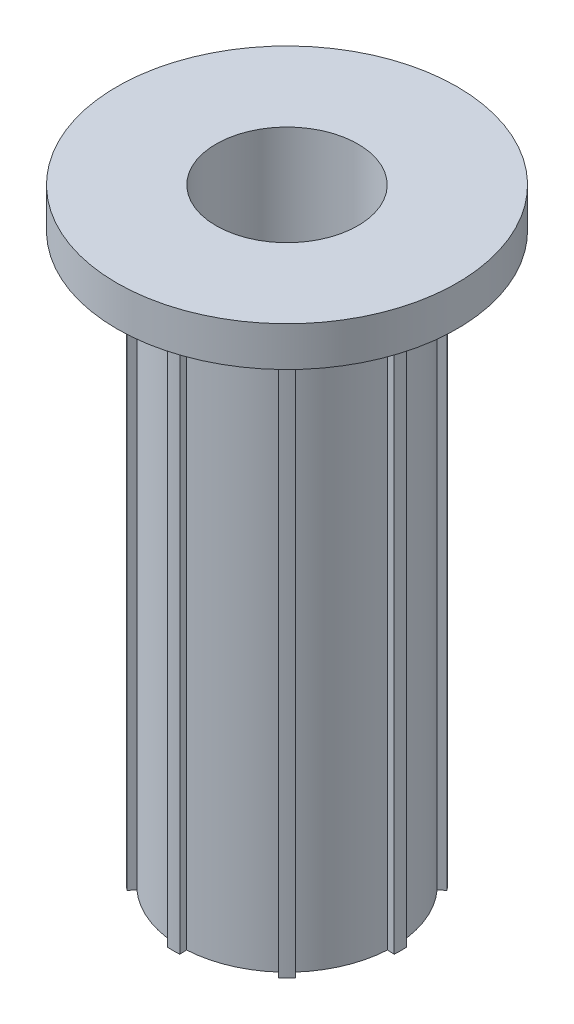
ISO-10303-21;
HEADER;
FILE_DESCRIPTION(('STEP AP214'),'2;1');
FILE_NAME('part.step','',(''),(''),'','','');
FILE_SCHEMA(('AUTOMOTIVE_DESIGN { 1 0 10303 214 1 1 1 1 }'));
ENDSEC;
DATA;
#1=APPLICATION_CONTEXT('core data for automotive mechanical design processes');
#2=APPLICATION_PROTOCOL_DEFINITION('international standard','automotive_design',2000,#1);
#3=PRODUCT_CONTEXT('',#1,'mechanical');
#4=PRODUCT('Part','Part','',(#3));
#5=PRODUCT_RELATED_PRODUCT_CATEGORY('part','',(#4));
#6=PRODUCT_DEFINITION_FORMATION('','',#4);
#7=PRODUCT_DEFINITION_CONTEXT('part definition',#1,'design');
#8=PRODUCT_DEFINITION('design','',#6,#7);
#9=PRODUCT_DEFINITION_SHAPE('','',#8);
#10=(LENGTH_UNIT() NAMED_UNIT(*) SI_UNIT(.MILLI.,.METRE.));
#11=(NAMED_UNIT(*) PLANE_ANGLE_UNIT() SI_UNIT($,.RADIAN.));
#12=(NAMED_UNIT(*) SI_UNIT($,.STERADIAN.) SOLID_ANGLE_UNIT());
#13=UNCERTAINTY_MEASURE_WITH_UNIT(LENGTH_MEASURE(1.E-05),#10,'distance_accuracy_value','');
#14=(GEOMETRIC_REPRESENTATION_CONTEXT(3) GLOBAL_UNCERTAINTY_ASSIGNED_CONTEXT((#13)) GLOBAL_UNIT_ASSIGNED_CONTEXT((#10,
#11,#12)) REPRESENTATION_CONTEXT('',''));
#15=CARTESIAN_POINT('',(0.,0.,0.));
#16=DIRECTION('',(0.,0.,1.));
#17=DIRECTION('',(1.,0.,0.));
#18=AXIS2_PLACEMENT_3D('',#15,#16,#17);
#19=CARTESIAN_POINT('',(0.,25.4,0.));
#20=DIRECTION('',(0.,-1.,0.));
#21=DIRECTION('',(0.,0.,-1.));
#22=AXIS2_PLACEMENT_3D('',#19,#20,#21);
#23=CYLINDRICAL_SURFACE('',#22,5.08);
#24=DIRECTION('',(0.,-1.,0.));
#25=VECTOR('',#24,1.);
#26=CARTESIAN_POINT('',(-3.39541124517394,25.4,3.77856883967281));
#27=LINE('',#26,#25);
#28=CARTESIAN_POINT('',(-3.39541124517394,25.4,3.77856883967281));
#29=VERTEX_POINT('',#28);
#30=CARTESIAN_POINT('',(-3.39541124517394,0.,3.77856883967281));
#31=VERTEX_POINT('',#30);
#32=EDGE_CURVE('E653',#29,#31,#27,.T.);
#33=ORIENTED_EDGE('',*,*,#32,.F.);
#34=CARTESIAN_POINT('',(0.,25.4,0.));
#35=DIRECTION('',(0.,1.,0.));
#36=DIRECTION('',(0.,0.,1.));
#37=AXIS2_PLACEMENT_3D('',#34,#35,#36);
#38=CIRCLE('',#37,5.08);
#39=CARTESIAN_POINT('',(-3.77856883967289,25.4,3.39541124517386));
#40=VERTEX_POINT('',#39);
#41=EDGE_CURVE('E317',#40,#29,#38,.T.);
#42=ORIENTED_EDGE('',*,*,#41,.F.);
#43=DIRECTION('',(0.,-1.,0.));
#44=VECTOR('',#43,1.);
#45=CARTESIAN_POINT('',(-3.77856883967289,25.4,3.39541124517386));
#46=LINE('',#45,#44);
#47=CARTESIAN_POINT('',(-3.77856883967289,0.,3.39541124517386));
#48=VERTEX_POINT('',#47);
#49=EDGE_CURVE('E353',#40,#48,#46,.T.);
#50=ORIENTED_EDGE('',*,*,#49,.T.);
#51=CARTESIAN_POINT('',(0.,0.,0.));
#52=DIRECTION('',(0.,1.,0.));
#53=DIRECTION('',(0.,0.,1.));
#54=AXIS2_PLACEMENT_3D('',#51,#52,#53);
#55=CIRCLE('',#54,5.08);
#56=EDGE_CURVE('E290',#48,#31,#55,.T.);
#57=ORIENTED_EDGE('',*,*,#56,.T.);
#58=EDGE_LOOP('',(#33,#42,#50,#57));
#59=FACE_BOUND('',#58,.T.);
#60=ADVANCED_FACE('F44',(#59),#23,.T.);
#61=DIRECTION('',(0.,-1.,0.));
#62=VECTOR('',#61,1.);
#63=CARTESIAN_POINT('',(-5.07276996609238,25.4,0.270933333333333));
#64=LINE('',#63,#62);
#65=CARTESIAN_POINT('',(-5.07276996609238,25.4,0.270933333333333));
#66=VERTEX_POINT('',#65);
#67=CARTESIAN_POINT('',(-5.07276996609238,0.,0.270933333333333));
#68=VERTEX_POINT('',#67);
#69=EDGE_CURVE('E507',#66,#68,#64,.T.);
#70=ORIENTED_EDGE('',*,*,#69,.F.);
#71=CARTESIAN_POINT('',(-5.07276996609238,25.4,-0.270933333333333));
#72=VERTEX_POINT('',#71);
#73=EDGE_CURVE('E279',#72,#66,#38,.T.);
#74=ORIENTED_EDGE('',*,*,#73,.F.);
#75=DIRECTION('',(0.,-1.,0.));
#76=VECTOR('',#75,1.);
#77=CARTESIAN_POINT('',(-5.07276996609238,25.4,-0.270933333333333));
#78=LINE('',#77,#76);
#79=CARTESIAN_POINT('',(-5.07276996609238,0.,-0.270933333333333));
#80=VERTEX_POINT('',#79);
#81=EDGE_CURVE('E257',#72,#80,#78,.T.);
#82=ORIENTED_EDGE('',*,*,#81,.T.);
#83=EDGE_CURVE('E277',#80,#68,#55,.T.);
#84=ORIENTED_EDGE('',*,*,#83,.T.);
#85=EDGE_LOOP('',(#70,#74,#82,#84));
#86=FACE_BOUND('',#85,.T.);
#87=ADVANCED_FACE('F274',(#86),#23,.T.);
#88=DIRECTION('',(0.,-1.,0.));
#89=VECTOR('',#88,1.);
#90=CARTESIAN_POINT('',(-0.270933333333333,25.4,-5.07276996609238));
#91=LINE('',#90,#89);
#92=CARTESIAN_POINT('',(-0.270933333333333,25.4,-5.07276996609238));
#93=VERTEX_POINT('',#92);
#94=CARTESIAN_POINT('',(-0.270933333333333,0.,-5.07276996609238));
#95=VERTEX_POINT('',#94);
#96=EDGE_CURVE('E338',#93,#95,#91,.T.);
#97=ORIENTED_EDGE('',*,*,#96,.F.);
#98=CARTESIAN_POINT('',(0.270933333333333,25.4,-5.07276996609238));
#99=VERTEX_POINT('',#98);
#100=EDGE_CURVE('E747',#99,#93,#38,.T.);
#101=ORIENTED_EDGE('',*,*,#100,.F.);
#102=DIRECTION('',(0.,-1.,0.));
#103=VECTOR('',#102,1.);
#104=CARTESIAN_POINT('',(0.270933333333333,25.4,-5.07276996609238));
#105=LINE('',#104,#103);
#106=CARTESIAN_POINT('',(0.270933333333333,0.,-5.07276996609238));
#107=VERTEX_POINT('',#106);
#108=EDGE_CURVE('E345',#99,#107,#105,.T.);
#109=ORIENTED_EDGE('',*,*,#108,.T.);
#110=EDGE_CURVE('E292',#107,#95,#55,.T.);
#111=ORIENTED_EDGE('',*,*,#110,.T.);
#112=EDGE_LOOP('',(#97,#101,#109,#111));
#113=FACE_BOUND('',#112,.T.);
#114=ADVANCED_FACE('F340',(#113),#23,.T.);
#115=DIRECTION('',(0.,-1.,0.));
#116=VECTOR('',#115,1.);
#117=CARTESIAN_POINT('',(3.39541124517386,25.4,-3.77856883967289));
#118=LINE('',#117,#116);
#119=CARTESIAN_POINT('',(3.39541124517386,25.4,-3.77856883967289));
#120=VERTEX_POINT('',#119);
#121=CARTESIAN_POINT('',(3.39541124517386,0.,-3.77856883967289));
#122=VERTEX_POINT('',#121);
#123=EDGE_CURVE('E380',#120,#122,#118,.T.);
#124=ORIENTED_EDGE('',*,*,#123,.F.);
#125=CARTESIAN_POINT('',(3.77856883967281,25.4,-3.39541124517394));
#126=VERTEX_POINT('',#125);
#127=EDGE_CURVE('E744',#126,#120,#38,.T.);
#128=ORIENTED_EDGE('',*,*,#127,.F.);
#129=DIRECTION('',(0.,-1.,0.));
#130=VECTOR('',#129,1.);
#131=CARTESIAN_POINT('',(3.77856883967281,25.4,-3.39541124517394));
#132=LINE('',#131,#130);
#133=CARTESIAN_POINT('',(3.77856883967281,0.,-3.39541124517394));
#134=VERTEX_POINT('',#133);
#135=EDGE_CURVE('E591',#126,#134,#132,.T.);
#136=ORIENTED_EDGE('',*,*,#135,.T.);
#137=EDGE_CURVE('E321',#134,#122,#55,.T.);
#138=ORIENTED_EDGE('',*,*,#137,.T.);
#139=EDGE_LOOP('',(#124,#128,#136,#138));
#140=FACE_BOUND('',#139,.T.);
#141=ADVANCED_FACE('F941',(#140),#23,.T.);
#142=CARTESIAN_POINT('',(-3.39541124517391,25.4,-3.77856883967284));
#143=VERTEX_POINT('',#142);
#144=CARTESIAN_POINT('',(-3.77856883967286,25.4,-3.39541124517389));
#145=VERTEX_POINT('',#144);
#146=EDGE_CURVE('E558',#143,#145,#38,.T.);
#147=ORIENTED_EDGE('',*,*,#146,.F.);
#148=DIRECTION('',(0.,-1.,0.));
#149=VECTOR('',#148,1.);
#150=CARTESIAN_POINT('',(-3.39541124517391,25.4,-3.77856883967284));
#151=LINE('',#150,#149);
#152=CARTESIAN_POINT('',(-3.39541124517391,0.,-3.77856883967284));
#153=VERTEX_POINT('',#152);
#154=EDGE_CURVE('E402',#143,#153,#151,.T.);
#155=ORIENTED_EDGE('',*,*,#154,.T.);
#156=CARTESIAN_POINT('',(-3.77856883967286,0.,-3.39541124517389));
#157=VERTEX_POINT('',#156);
#158=EDGE_CURVE('E288',#153,#157,#55,.T.);
#159=ORIENTED_EDGE('',*,*,#158,.T.);
#160=DIRECTION('',(0.,-1.,0.));
#161=VECTOR('',#160,1.);
#162=CARTESIAN_POINT('',(-3.77856883967286,25.4,-3.39541124517389));
#163=LINE('',#162,#161);
#164=EDGE_CURVE('E575',#145,#157,#163,.T.);
#165=ORIENTED_EDGE('',*,*,#164,.F.);
#166=EDGE_LOOP('',(#147,#155,#159,#165));
#167=FACE_BOUND('',#166,.T.);
#168=ADVANCED_FACE('F559',(#167),#23,.T.);
#169=DIRECTION('',(0.,-1.,0.));
#170=VECTOR('',#169,1.);
#171=CARTESIAN_POINT('',(5.07276996609238,25.4,-0.270933333333333));
#172=LINE('',#171,#170);
#173=CARTESIAN_POINT('',(5.07276996609238,25.4,-0.270933333333333));
#174=VERTEX_POINT('',#173);
#175=CARTESIAN_POINT('',(5.07276996609238,0.,-0.270933333333333));
#176=VERTEX_POINT('',#175);
#177=EDGE_CURVE('E577',#174,#176,#172,.T.);
#178=ORIENTED_EDGE('',*,*,#177,.F.);
#179=CARTESIAN_POINT('',(5.07276996609238,25.4,0.270933333333333));
#180=VERTEX_POINT('',#179);
#181=EDGE_CURVE('E54',#180,#174,#38,.T.);
#182=ORIENTED_EDGE('',*,*,#181,.F.);
#183=DIRECTION('',(0.,-1.,0.));
#184=VECTOR('',#183,1.);
#185=CARTESIAN_POINT('',(5.07276996609238,25.4,0.270933333333333));
#186=LINE('',#185,#184);
#187=CARTESIAN_POINT('',(5.07276996609238,0.,0.270933333333333));
#188=VERTEX_POINT('',#187);
#189=EDGE_CURVE('E627',#180,#188,#186,.T.);
#190=ORIENTED_EDGE('',*,*,#189,.T.);
#191=EDGE_CURVE('E313',#188,#176,#55,.T.);
#192=ORIENTED_EDGE('',*,*,#191,.T.);
#193=EDGE_LOOP('',(#178,#182,#190,#192));
#194=FACE_BOUND('',#193,.T.);
#195=ADVANCED_FACE('F487',(#194),#23,.T.);
#196=DIRECTION('',(0.,-1.,0.));
#197=VECTOR('',#196,1.);
#198=CARTESIAN_POINT('',(3.77856883967284,25.4,3.39541124517391));
#199=LINE('',#198,#197);
#200=CARTESIAN_POINT('',(3.77856883967284,25.4,3.39541124517391));
#201=VERTEX_POINT('',#200);
#202=CARTESIAN_POINT('',(3.77856883967284,0.,3.39541124517391));
#203=VERTEX_POINT('',#202);
#204=EDGE_CURVE('E613',#201,#203,#199,.T.);
#205=ORIENTED_EDGE('',*,*,#204,.F.);
#206=CARTESIAN_POINT('',(3.39541124517389,25.4,3.77856883967286));
#207=VERTEX_POINT('',#206);
#208=EDGE_CURVE('E11',#207,#201,#38,.T.);
#209=ORIENTED_EDGE('',*,*,#208,.F.);
#210=DIRECTION('',(0.,-1.,0.));
#211=VECTOR('',#210,1.);
#212=CARTESIAN_POINT('',(3.39541124517389,25.4,3.77856883967286));
#213=LINE('',#212,#211);
#214=CARTESIAN_POINT('',(3.39541124517389,0.,3.77856883967286));
#215=VERTEX_POINT('',#214);
#216=EDGE_CURVE('E436',#207,#215,#213,.T.);
#217=ORIENTED_EDGE('',*,*,#216,.T.);
#218=EDGE_CURVE('E298',#215,#203,#55,.T.);
#219=ORIENTED_EDGE('',*,*,#218,.T.);
#220=EDGE_LOOP('',(#205,#209,#217,#219));
#221=FACE_BOUND('',#220,.T.);
#222=ADVANCED_FACE('F484',(#221),#23,.T.);
#223=CARTESIAN_POINT('',(-0.270933333333333,25.4,5.07276996609238));
#224=VERTEX_POINT('',#223);
#225=CARTESIAN_POINT('',(0.270933333333333,25.4,5.07276996609238));
#226=VERTEX_POINT('',#225);
#227=EDGE_CURVE('E57',#224,#226,#38,.T.);
#228=ORIENTED_EDGE('',*,*,#227,.F.);
#229=DIRECTION('',(0.,-1.,0.));
#230=VECTOR('',#229,1.);
#231=CARTESIAN_POINT('',(-0.270933333333333,25.4,5.07276996609238));
#232=LINE('',#231,#230);
#233=CARTESIAN_POINT('',(-0.270933333333333,0.,5.07276996609238));
#234=VERTEX_POINT('',#233);
#235=EDGE_CURVE('E491',#224,#234,#232,.T.);
#236=ORIENTED_EDGE('',*,*,#235,.T.);
#237=CARTESIAN_POINT('',(0.270933333333333,0.,5.07276996609238));
#238=VERTEX_POINT('',#237);
#239=EDGE_CURVE('E47',#234,#238,#55,.T.);
#240=ORIENTED_EDGE('',*,*,#239,.T.);
#241=DIRECTION('',(0.,-1.,0.));
#242=VECTOR('',#241,1.);
#243=CARTESIAN_POINT('',(0.270933333333333,25.4,5.07276996609238));
#244=LINE('',#243,#242);
#245=EDGE_CURVE('E422',#226,#238,#244,.T.);
#246=ORIENTED_EDGE('',*,*,#245,.F.);
#247=EDGE_LOOP('',(#228,#236,#240,#246));
#248=FACE_BOUND('',#247,.T.);
#249=ADVANCED_FACE('F50',(#248),#23,.T.);
#250=CARTESIAN_POINT('',(0.,0.,0.));
#251=DIRECTION('',(0.,1.,0.));
#252=DIRECTION('',(0.,0.,1.));
#253=AXIS2_PLACEMENT_3D('',#250,#251,#252);
#254=PLANE('',#253);
#255=DIRECTION('',(0.998576764978815,0.,-0.0533333333333335));
#256=VECTOR('',#255,1.);
#257=CARTESIAN_POINT('',(-4.75572184321161,0.,0.254));
#258=LINE('',#257,#256);
#259=CARTESIAN_POINT('',(-4.75572184321161,0.,0.254000000000001));
#260=VERTEX_POINT('',#259);
#261=EDGE_CURVE('E72',#68,#260,#258,.T.);
#262=ORIENTED_EDGE('',*,*,#261,.F.);
#263=ORIENTED_EDGE('',*,*,#83,.F.);
#264=DIRECTION('',(-0.998576764978815,0.,-0.0533333333333335));
#265=VECTOR('',#264,1.);
#266=CARTESIAN_POINT('',(-4.75572184321161,0.,-0.254));
#267=LINE('',#266,#265);
#268=CARTESIAN_POINT('',(-4.75572184321161,0.,-0.254));
#269=VERTEX_POINT('',#268);
#270=EDGE_CURVE('E258',#269,#80,#267,.T.);
#271=ORIENTED_EDGE('',*,*,#270,.F.);
#272=CARTESIAN_POINT('',(0.,0.,0.));
#273=DIRECTION('',(0.,1.,0.));
#274=DIRECTION('',(0.,0.,-1.));
#275=AXIS2_PLACEMENT_3D('',#272,#273,#274);
#276=CIRCLE('',#275,4.7625);
#277=CARTESIAN_POINT('',(-3.54240828719331,0.,-3.18319804235052));
#278=VERTEX_POINT('',#277);
#279=EDGE_CURVE('E268',#278,#269,#276,.T.);
#280=ORIENTED_EDGE('',*,*,#279,.F.);
#281=DIRECTION('',(0.743812763715128,0.,0.668388040388563));
#282=VECTOR('',#281,1.);
#283=CARTESIAN_POINT('',(-3.54240828719331,0.,-3.18319804235052));
#284=LINE('',#283,#282);
#285=EDGE_CURVE('E388',#157,#278,#284,.T.);
#286=ORIENTED_EDGE('',*,*,#285,.F.);
#287=ORIENTED_EDGE('',*,*,#158,.F.);
#288=DIRECTION('',(-0.668388040388563,0.,-0.743812763715128));
#289=VECTOR('',#288,1.);
#290=CARTESIAN_POINT('',(-3.18319804235054,0.,-3.54240828719328));
#291=LINE('',#290,#289);
#292=CARTESIAN_POINT('',(-3.18319804235054,0.,-3.54240828719328));
#293=VERTEX_POINT('',#292);
#294=EDGE_CURVE('E363',#293,#153,#291,.T.);
#295=ORIENTED_EDGE('',*,*,#294,.F.);
#296=CARTESIAN_POINT('',(0.,0.,0.));
#297=DIRECTION('',(0.,1.,0.));
#298=DIRECTION('',(0.,0.,-1.));
#299=AXIS2_PLACEMENT_3D('',#296,#297,#298);
#300=CIRCLE('',#299,4.7625);
#301=CARTESIAN_POINT('',(-0.254,0.,-4.75572184321161));
#302=VERTEX_POINT('',#301);
#303=EDGE_CURVE('E352',#302,#293,#300,.T.);
#304=ORIENTED_EDGE('',*,*,#303,.F.);
#305=DIRECTION('',(0.0533333333333333,0.,0.998576764978815));
#306=VECTOR('',#305,1.);
#307=CARTESIAN_POINT('',(-0.254,0.,-4.75572184321161));
#308=LINE('',#307,#306);
#309=EDGE_CURVE('E346',#95,#302,#308,.T.);
#310=ORIENTED_EDGE('',*,*,#309,.F.);
#311=ORIENTED_EDGE('',*,*,#110,.F.);
#312=DIRECTION('',(0.0533333333333335,0.,-0.998576764978815));
#313=VECTOR('',#312,1.);
#314=CARTESIAN_POINT('',(0.254,0.,-4.75572184321161));
#315=LINE('',#314,#313);
#316=CARTESIAN_POINT('',(0.254,0.,-4.75572184321161));
#317=VERTEX_POINT('',#316);
#318=EDGE_CURVE('E347',#317,#107,#315,.T.);
#319=ORIENTED_EDGE('',*,*,#318,.F.);
#320=CARTESIAN_POINT('',(0.,0.,0.));
#321=DIRECTION('',(0.,1.,0.));
#322=DIRECTION('',(0.,0.,-1.));
#323=AXIS2_PLACEMENT_3D('',#320,#321,#322);
#324=CIRCLE('',#323,4.7625);
#325=CARTESIAN_POINT('',(3.18319804235049,0.,-3.54240828719333));
#326=VERTEX_POINT('',#325);
#327=EDGE_CURVE('E395',#326,#317,#324,.T.);
#328=ORIENTED_EDGE('',*,*,#327,.F.);
#329=DIRECTION('',(-0.668388040388562,0.,0.743812763715129));
#330=VECTOR('',#329,1.);
#331=CARTESIAN_POINT('',(3.18319804235049,0.,-3.54240828719333));
#332=LINE('',#331,#330);
#333=EDGE_CURVE('E396',#122,#326,#332,.T.);
#334=ORIENTED_EDGE('',*,*,#333,.F.);
#335=ORIENTED_EDGE('',*,*,#137,.F.);
#336=DIRECTION('',(0.743812763715128,0.,-0.668388040388563));
#337=VECTOR('',#336,1.);
#338=CARTESIAN_POINT('',(3.54240828719326,0.,-3.18319804235057));
#339=LINE('',#338,#337);
#340=CARTESIAN_POINT('',(3.54240828719326,0.,-3.18319804235057));
#341=VERTEX_POINT('',#340);
#342=EDGE_CURVE('E594',#341,#134,#339,.T.);
#343=ORIENTED_EDGE('',*,*,#342,.F.);
#344=CARTESIAN_POINT('',(0.,0.,0.));
#345=DIRECTION('',(0.,1.,0.));
#346=DIRECTION('',(0.,0.,-1.));
#347=AXIS2_PLACEMENT_3D('',#344,#345,#346);
#348=CIRCLE('',#347,4.7625);
#349=CARTESIAN_POINT('',(4.75572184321161,0.,-0.254));
#350=VERTEX_POINT('',#349);
#351=EDGE_CURVE('E598',#350,#341,#348,.T.);
#352=ORIENTED_EDGE('',*,*,#351,.F.);
#353=DIRECTION('',(-0.998576764978815,0.,0.0533333333333335));
#354=VECTOR('',#353,1.);
#355=CARTESIAN_POINT('',(5.07276996609238,0.,-0.270933333333333));
#356=LINE('',#355,#354);
#357=EDGE_CURVE('E278',#176,#350,#356,.T.);
#358=ORIENTED_EDGE('',*,*,#357,.F.);
#359=ORIENTED_EDGE('',*,*,#191,.F.);
#360=DIRECTION('',(0.998576764978815,0.,0.0533333333333335));
#361=VECTOR('',#360,1.);
#362=CARTESIAN_POINT('',(5.07276996609238,0.,0.270933333333333));
#363=LINE('',#362,#361);
#364=CARTESIAN_POINT('',(4.75572184321161,0.,0.254));
#365=VERTEX_POINT('',#364);
#366=EDGE_CURVE('E626',#365,#188,#363,.T.);
#367=ORIENTED_EDGE('',*,*,#366,.F.);
#368=CARTESIAN_POINT('',(0.,0.,0.));
#369=DIRECTION('',(0.,1.,0.));
#370=DIRECTION('',(0.,0.,-1.));
#371=AXIS2_PLACEMENT_3D('',#368,#369,#370);
#372=CIRCLE('',#371,4.7625);
#373=CARTESIAN_POINT('',(3.54240828719329,0.,3.18319804235054));
#374=VERTEX_POINT('',#373);
#375=EDGE_CURVE('E635',#374,#365,#372,.T.);
#376=ORIENTED_EDGE('',*,*,#375,.F.);
#377=DIRECTION('',(-0.743812763715128,0.,-0.668388040388563));
#378=VECTOR('',#377,1.);
#379=CARTESIAN_POINT('',(3.77856883967284,0.,3.39541124517391));
#380=LINE('',#379,#378);
#381=EDGE_CURVE('E592',#203,#374,#380,.T.);
#382=ORIENTED_EDGE('',*,*,#381,.F.);
#383=ORIENTED_EDGE('',*,*,#218,.F.);
#384=DIRECTION('',(0.668388040388563,0.,0.743812763715128));
#385=VECTOR('',#384,1.);
#386=CARTESIAN_POINT('',(3.39541124517389,0.,3.77856883967286));
#387=LINE('',#386,#385);
#388=CARTESIAN_POINT('',(3.18319804235052,0.,3.54240828719331));
#389=VERTEX_POINT('',#388);
#390=EDGE_CURVE('E417',#389,#215,#387,.T.);
#391=ORIENTED_EDGE('',*,*,#390,.F.);
#392=CARTESIAN_POINT('',(0.,0.,0.));
#393=DIRECTION('',(0.,1.,0.));
#394=DIRECTION('',(0.,0.,-1.));
#395=AXIS2_PLACEMENT_3D('',#392,#393,#394);
#396=CIRCLE('',#395,4.7625);
#397=CARTESIAN_POINT('',(0.254,0.,4.75572184321161));
#398=VERTEX_POINT('',#397);
#399=EDGE_CURVE('E427',#398,#389,#396,.T.);
#400=ORIENTED_EDGE('',*,*,#399,.F.);
#401=DIRECTION('',(-0.0533333333333334,0.,-0.998576764978815));
#402=VECTOR('',#401,1.);
#403=CARTESIAN_POINT('',(0.270933333333333,0.,5.07276996609238));
#404=LINE('',#403,#402);
#405=EDGE_CURVE('E426',#238,#398,#404,.T.);
#406=ORIENTED_EDGE('',*,*,#405,.F.);
#407=ORIENTED_EDGE('',*,*,#239,.F.);
#408=DIRECTION('',(-0.0533333333333334,0.,0.998576764978815));
#409=VECTOR('',#408,1.);
#410=CARTESIAN_POINT('',(-0.270933333333333,0.,5.07276996609238));
#411=LINE('',#410,#409);
#412=CARTESIAN_POINT('',(-0.254,0.,4.75572184321161));
#413=VERTEX_POINT('',#412);
#414=EDGE_CURVE('E659',#413,#234,#411,.T.);
#415=ORIENTED_EDGE('',*,*,#414,.F.);
#416=CARTESIAN_POINT('',(0.,0.,0.));
#417=DIRECTION('',(0.,1.,0.));
#418=DIRECTION('',(0.,0.,-1.));
#419=AXIS2_PLACEMENT_3D('',#416,#417,#418);
#420=CIRCLE('',#419,4.7625);
#421=CARTESIAN_POINT('',(-3.18319804235057,0.,3.54240828719326));
#422=VERTEX_POINT('',#421);
#423=EDGE_CURVE('E429',#422,#413,#420,.T.);
#424=ORIENTED_EDGE('',*,*,#423,.F.);
#425=DIRECTION('',(0.668388040388563,0.,-0.743812763715127));
#426=VECTOR('',#425,1.);
#427=CARTESIAN_POINT('',(-3.39541124517394,0.,3.77856883967281));
#428=LINE('',#427,#426);
#429=EDGE_CURVE('E65',#31,#422,#428,.T.);
#430=ORIENTED_EDGE('',*,*,#429,.F.);
#431=ORIENTED_EDGE('',*,*,#56,.F.);
#432=DIRECTION('',(-0.743812763715128,0.,0.668388040388563));
#433=VECTOR('',#432,1.);
#434=CARTESIAN_POINT('',(-3.77856883967289,0.,3.39541124517386));
#435=LINE('',#434,#433);
#436=CARTESIAN_POINT('',(-3.54240828719333,0.,3.18319804235049));
#437=VERTEX_POINT('',#436);
#438=EDGE_CURVE('E516',#437,#48,#435,.T.);
#439=ORIENTED_EDGE('',*,*,#438,.F.);
#440=CARTESIAN_POINT('',(0.,0.,0.));
#441=DIRECTION('',(0.,1.,0.));
#442=DIRECTION('',(0.,0.,-1.));
#443=AXIS2_PLACEMENT_3D('',#440,#441,#442);
#444=CIRCLE('',#443,4.7625);
#445=EDGE_CURVE('E525',#260,#437,#444,.T.);
#446=ORIENTED_EDGE('',*,*,#445,.F.);
#447=EDGE_LOOP('',(#262,#263,#271,#280,#286,#287,#295,#304,#310,#311,#319,#328,#334,#335,#343,
#352,#358,#359,#367,#376,#382,#383,#391,#400,#406,#407,#415,#424,#430,#431,#439,#446));
#448=FACE_BOUND('',#447,.T.);
#449=CARTESIAN_POINT('',(0.,0.,0.));
#450=DIRECTION('',(0.,1.,0.));
#451=DIRECTION('',(0.,0.,1.));
#452=AXIS2_PLACEMENT_3D('',#449,#450,#451);
#453=CIRCLE('',#452,3.175);
#454=CARTESIAN_POINT('',(0.,0.,3.175));
#455=VERTEX_POINT('',#454);
#456=EDGE_CURVE('E446',#455,#455,#453,.T.);
#457=ORIENTED_EDGE('',*,*,#456,.T.);
#458=EDGE_LOOP('',(#457));
#459=FACE_BOUND('',#458,.T.);
#460=ADVANCED_FACE('F284',(#448,#459),#254,.F.);
#461=CARTESIAN_POINT('',(0.,27.178,0.));
#462=DIRECTION('',(0.,-1.,0.));
#463=DIRECTION('',(0.,0.,-1.));
#464=AXIS2_PLACEMENT_3D('',#461,#462,#463);
#465=CYLINDRICAL_SURFACE('',#464,7.62);
#466=CARTESIAN_POINT('',(0.,27.178,0.));
#467=DIRECTION('',(0.,1.,0.));
#468=DIRECTION('',(0.,0.,1.));
#469=AXIS2_PLACEMENT_3D('',#466,#467,#468);
#470=CIRCLE('',#469,7.62);
#471=CARTESIAN_POINT('',(0.,27.178,7.62));
#472=VERTEX_POINT('',#471);
#473=EDGE_CURVE('E296',#472,#472,#470,.T.);
#474=ORIENTED_EDGE('',*,*,#473,.F.);
#475=EDGE_LOOP('',(#474));
#476=FACE_BOUND('',#475,.T.);
#477=CARTESIAN_POINT('',(0.,25.4,0.));
#478=DIRECTION('',(0.,1.,0.));
#479=DIRECTION('',(0.,0.,1.));
#480=AXIS2_PLACEMENT_3D('',#477,#478,#479);
#481=CIRCLE('',#480,7.62);
#482=CARTESIAN_POINT('',(0.,25.4,7.62));
#483=VERTEX_POINT('',#482);
#484=EDGE_CURVE('E307',#483,#483,#481,.T.);
#485=ORIENTED_EDGE('',*,*,#484,.T.);
#486=EDGE_LOOP('',(#485));
#487=FACE_BOUND('',#486,.T.);
#488=ADVANCED_FACE('F458',(#476,#487),#465,.T.);
#489=CARTESIAN_POINT('',(0.,27.178,0.));
#490=DIRECTION('',(0.,1.,0.));
#491=DIRECTION('',(0.,0.,1.));
#492=AXIS2_PLACEMENT_3D('',#489,#490,#491);
#493=PLANE('',#492);
#494=CARTESIAN_POINT('',(0.,27.178,0.));
#495=DIRECTION('',(0.,1.,0.));
#496=DIRECTION('',(0.,0.,1.));
#497=AXIS2_PLACEMENT_3D('',#494,#495,#496);
#498=CIRCLE('',#497,3.175);
#499=CARTESIAN_POINT('',(0.,27.178,3.175));
#500=VERTEX_POINT('',#499);
#501=EDGE_CURVE('E438',#500,#500,#498,.T.);
#502=ORIENTED_EDGE('',*,*,#501,.F.);
#503=EDGE_LOOP('',(#502));
#504=FACE_BOUND('',#503,.T.);
#505=ORIENTED_EDGE('',*,*,#473,.T.);
#506=EDGE_LOOP('',(#505));
#507=FACE_BOUND('',#506,.T.);
#508=ADVANCED_FACE('F463',(#504,#507),#493,.T.);
#509=CARTESIAN_POINT('',(0.,25.4,0.));
#510=DIRECTION('',(0.,1.,0.));
#511=DIRECTION('',(0.,0.,1.));
#512=AXIS2_PLACEMENT_3D('',#509,#510,#511);
#513=PLANE('',#512);
#514=ORIENTED_EDGE('',*,*,#227,.T.);
#515=DIRECTION('',(-0.0533333333333334,0.,-0.998576764978815));
#516=VECTOR('',#515,1.);
#517=CARTESIAN_POINT('',(0.270933333333333,25.4,5.07276996609238));
#518=LINE('',#517,#516);
#519=CARTESIAN_POINT('',(0.254,25.4,4.75572184321161));
#520=VERTEX_POINT('',#519);
#521=EDGE_CURVE('E415',#226,#520,#518,.T.);
#522=ORIENTED_EDGE('',*,*,#521,.T.);
#523=CARTESIAN_POINT('',(0.,25.4,0.));
#524=DIRECTION('',(0.,1.,0.));
#525=DIRECTION('',(0.,0.,-1.));
#526=AXIS2_PLACEMENT_3D('',#523,#524,#525);
#527=CIRCLE('',#526,4.7625);
#528=CARTESIAN_POINT('',(3.18319804235052,25.4,3.54240828719331));
#529=VERTEX_POINT('',#528);
#530=EDGE_CURVE('E418',#520,#529,#527,.T.);
#531=ORIENTED_EDGE('',*,*,#530,.T.);
#532=DIRECTION('',(0.668388040388563,0.,0.743812763715128));
#533=VECTOR('',#532,1.);
#534=CARTESIAN_POINT('',(3.39541124517389,25.4,3.77856883967286));
#535=LINE('',#534,#533);
#536=EDGE_CURVE('E423',#529,#207,#535,.T.);
#537=ORIENTED_EDGE('',*,*,#536,.T.);
#538=ORIENTED_EDGE('',*,*,#208,.T.);
#539=DIRECTION('',(-0.743812763715128,0.,-0.668388040388563));
#540=VECTOR('',#539,1.);
#541=CARTESIAN_POINT('',(3.77856883967284,25.4,3.39541124517391));
#542=LINE('',#541,#540);
#543=CARTESIAN_POINT('',(3.54240828719329,25.4,3.18319804235054));
#544=VERTEX_POINT('',#543);
#545=EDGE_CURVE('E631',#201,#544,#542,.T.);
#546=ORIENTED_EDGE('',*,*,#545,.T.);
#547=CARTESIAN_POINT('',(0.,25.4,0.));
#548=DIRECTION('',(0.,1.,0.));
#549=DIRECTION('',(0.,0.,-1.));
#550=AXIS2_PLACEMENT_3D('',#547,#548,#549);
#551=CIRCLE('',#550,4.7625);
#552=CARTESIAN_POINT('',(4.75572184321161,25.4,0.254));
#553=VERTEX_POINT('',#552);
#554=EDGE_CURVE('E645',#544,#553,#551,.T.);
#555=ORIENTED_EDGE('',*,*,#554,.T.);
#556=DIRECTION('',(0.998576764978815,0.,0.0533333333333335));
#557=VECTOR('',#556,1.);
#558=CARTESIAN_POINT('',(5.07276996609238,25.4,0.270933333333333));
#559=LINE('',#558,#557);
#560=EDGE_CURVE('E616',#553,#180,#559,.T.);
#561=ORIENTED_EDGE('',*,*,#560,.T.);
#562=ORIENTED_EDGE('',*,*,#181,.T.);
#563=DIRECTION('',(-0.998576764978815,0.,0.0533333333333335));
#564=VECTOR('',#563,1.);
#565=CARTESIAN_POINT('',(5.07276996609238,25.4,-0.270933333333333));
#566=LINE('',#565,#564);
#567=CARTESIAN_POINT('',(4.75572184321161,25.4,-0.254));
#568=VERTEX_POINT('',#567);
#569=EDGE_CURVE('E597',#174,#568,#566,.T.);
#570=ORIENTED_EDGE('',*,*,#569,.T.);
#571=CARTESIAN_POINT('',(0.,25.4,0.));
#572=DIRECTION('',(0.,1.,0.));
#573=DIRECTION('',(0.,0.,-1.));
#574=AXIS2_PLACEMENT_3D('',#571,#572,#573);
#575=CIRCLE('',#574,4.7625);
#576=CARTESIAN_POINT('',(3.54240828719326,25.4,-3.18319804235057));
#577=VERTEX_POINT('',#576);
#578=EDGE_CURVE('E609',#568,#577,#575,.T.);
#579=ORIENTED_EDGE('',*,*,#578,.T.);
#580=DIRECTION('',(0.743812763715128,0.,-0.668388040388563));
#581=VECTOR('',#580,1.);
#582=CARTESIAN_POINT('',(3.54240828719326,25.4,-3.18319804235057));
#583=LINE('',#582,#581);
#584=EDGE_CURVE('E581',#577,#126,#583,.T.);
#585=ORIENTED_EDGE('',*,*,#584,.T.);
#586=ORIENTED_EDGE('',*,*,#127,.T.);
#587=DIRECTION('',(-0.668388040388562,0.,0.743812763715129));
#588=VECTOR('',#587,1.);
#589=CARTESIAN_POINT('',(3.18319804235049,25.4,-3.54240828719333));
#590=LINE('',#589,#588);
#591=CARTESIAN_POINT('',(3.18319804235049,25.4,-3.54240828719333));
#592=VERTEX_POINT('',#591);
#593=EDGE_CURVE('E391',#120,#592,#590,.T.);
#594=ORIENTED_EDGE('',*,*,#593,.T.);
#595=CARTESIAN_POINT('',(0.,25.4,0.));
#596=DIRECTION('',(0.,1.,0.));
#597=DIRECTION('',(0.,0.,-1.));
#598=AXIS2_PLACEMENT_3D('',#595,#596,#597);
#599=CIRCLE('',#598,4.7625);
#600=CARTESIAN_POINT('',(0.254,25.4,-4.75572184321161));
#601=VERTEX_POINT('',#600);
#602=EDGE_CURVE('E403',#592,#601,#599,.T.);
#603=ORIENTED_EDGE('',*,*,#602,.T.);
#604=DIRECTION('',(0.0533333333333335,0.,-0.998576764978815));
#605=VECTOR('',#604,1.);
#606=CARTESIAN_POINT('',(0.254,25.4,-4.75572184321161));
#607=LINE('',#606,#605);
#608=EDGE_CURVE('E379',#601,#99,#607,.T.);
#609=ORIENTED_EDGE('',*,*,#608,.T.);
#610=ORIENTED_EDGE('',*,*,#100,.T.);
#611=DIRECTION('',(0.0533333333333333,0.,0.998576764978815));
#612=VECTOR('',#611,1.);
#613=CARTESIAN_POINT('',(-0.254,25.4,-4.75572184321161));
#614=LINE('',#613,#612);
#615=CARTESIAN_POINT('',(-0.254,25.4,-4.75572184321161));
#616=VERTEX_POINT('',#615);
#617=EDGE_CURVE('E373',#93,#616,#614,.T.);
#618=ORIENTED_EDGE('',*,*,#617,.T.);
#619=CARTESIAN_POINT('',(0.,25.4,0.));
#620=DIRECTION('',(0.,1.,0.));
#621=DIRECTION('',(0.,0.,-1.));
#622=AXIS2_PLACEMENT_3D('',#619,#620,#621);
#623=CIRCLE('',#622,4.7625);
#624=CARTESIAN_POINT('',(-3.18319804235054,25.4,-3.54240828719328));
#625=VERTEX_POINT('',#624);
#626=EDGE_CURVE('E369',#616,#625,#623,.T.);
#627=ORIENTED_EDGE('',*,*,#626,.T.);
#628=DIRECTION('',(-0.668388040388563,0.,-0.743812763715128));
#629=VECTOR('',#628,1.);
#630=CARTESIAN_POINT('',(-3.18319804235054,25.4,-3.54240828719328));
#631=LINE('',#630,#629);
#632=EDGE_CURVE('E364',#625,#143,#631,.T.);
#633=ORIENTED_EDGE('',*,*,#632,.T.);
#634=ORIENTED_EDGE('',*,*,#146,.T.);
#635=DIRECTION('',(0.743812763715128,0.,0.668388040388563));
#636=VECTOR('',#635,1.);
#637=CARTESIAN_POINT('',(-3.54240828719331,25.4,-3.18319804235052));
#638=LINE('',#637,#636);
#639=CARTESIAN_POINT('',(-3.54240828719331,25.4,-3.18319804235052));
#640=VERTEX_POINT('',#639);
#641=EDGE_CURVE('E267',#145,#640,#638,.T.);
#642=ORIENTED_EDGE('',*,*,#641,.T.);
#643=CARTESIAN_POINT('',(0.,25.4,0.));
#644=DIRECTION('',(0.,1.,0.));
#645=DIRECTION('',(0.,0.,-1.));
#646=AXIS2_PLACEMENT_3D('',#643,#644,#645);
#647=CIRCLE('',#646,4.7625);
#648=CARTESIAN_POINT('',(-4.75572184321161,25.4,-0.254));
#649=VERTEX_POINT('',#648);
#650=EDGE_CURVE('E574',#640,#649,#647,.T.);
#651=ORIENTED_EDGE('',*,*,#650,.T.);
#652=DIRECTION('',(-0.998576764978815,0.,-0.0533333333333335));
#653=VECTOR('',#652,1.);
#654=CARTESIAN_POINT('',(-4.75572184321161,25.4,-0.254));
#655=LINE('',#654,#653);
#656=EDGE_CURVE('E569',#649,#72,#655,.T.);
#657=ORIENTED_EDGE('',*,*,#656,.T.);
#658=ORIENTED_EDGE('',*,*,#73,.T.);
#659=DIRECTION('',(0.998576764978815,0.,-0.0533333333333335));
#660=VECTOR('',#659,1.);
#661=CARTESIAN_POINT('',(-4.75572184321161,25.4,0.254));
#662=LINE('',#661,#660);
#663=CARTESIAN_POINT('',(-4.75572184321161,25.4,0.254000000000001));
#664=VERTEX_POINT('',#663);
#665=EDGE_CURVE('E521',#66,#664,#662,.T.);
#666=ORIENTED_EDGE('',*,*,#665,.T.);
#667=CARTESIAN_POINT('',(0.,25.4,0.));
#668=DIRECTION('',(0.,1.,0.));
#669=DIRECTION('',(0.,0.,-1.));
#670=AXIS2_PLACEMENT_3D('',#667,#668,#669);
#671=CIRCLE('',#670,4.7625);
#672=CARTESIAN_POINT('',(-3.54240828719333,25.4,3.18319804235049));
#673=VERTEX_POINT('',#672);
#674=EDGE_CURVE('E531',#664,#673,#671,.T.);
#675=ORIENTED_EDGE('',*,*,#674,.T.);
#676=DIRECTION('',(-0.743812763715128,0.,0.668388040388563));
#677=VECTOR('',#676,1.);
#678=CARTESIAN_POINT('',(-3.77856883967289,25.4,3.39541124517386));
#679=LINE('',#678,#677);
#680=EDGE_CURVE('E511',#673,#40,#679,.T.);
#681=ORIENTED_EDGE('',*,*,#680,.T.);
#682=ORIENTED_EDGE('',*,*,#41,.T.);
#683=DIRECTION('',(0.668388040388563,0.,-0.743812763715127));
#684=VECTOR('',#683,1.);
#685=CARTESIAN_POINT('',(-3.39541124517394,25.4,3.77856883967281));
#686=LINE('',#685,#684);
#687=CARTESIAN_POINT('',(-3.18319804235057,25.4,3.54240828719326));
#688=VERTEX_POINT('',#687);
#689=EDGE_CURVE('E502',#29,#688,#686,.T.);
#690=ORIENTED_EDGE('',*,*,#689,.T.);
#691=CARTESIAN_POINT('',(0.,25.4,0.));
#692=DIRECTION('',(0.,1.,0.));
#693=DIRECTION('',(0.,0.,-1.));
#694=AXIS2_PLACEMENT_3D('',#691,#692,#693);
#695=CIRCLE('',#694,4.7625);
#696=CARTESIAN_POINT('',(-0.254,25.4,4.75572184321161));
#697=VERTEX_POINT('',#696);
#698=EDGE_CURVE('E499',#688,#697,#695,.T.);
#699=ORIENTED_EDGE('',*,*,#698,.T.);
#700=DIRECTION('',(-0.0533333333333334,0.,0.998576764978815));
#701=VECTOR('',#700,1.);
#702=CARTESIAN_POINT('',(-0.270933333333333,25.4,5.07276996609238));
#703=LINE('',#702,#701);
#704=EDGE_CURVE('E494',#697,#224,#703,.T.);
#705=ORIENTED_EDGE('',*,*,#704,.T.);
#706=EDGE_LOOP('',(#514,#522,#531,#537,#538,#546,#555,#561,#562,#570,#579,#585,#586,#594,#603,
#609,#610,#618,#627,#633,#634,#642,#651,#657,#658,#666,#675,#681,#682,#690,#699,#705));
#707=FACE_BOUND('',#706,.T.);
#708=ORIENTED_EDGE('',*,*,#484,.F.);
#709=EDGE_LOOP('',(#708));
#710=FACE_BOUND('',#709,.T.);
#711=ADVANCED_FACE('F464',(#707,#710),#513,.F.);
#712=CARTESIAN_POINT('',(0.,0.,0.));
#713=DIRECTION('',(0.,1.,0.));
#714=DIRECTION('',(0.,0.,1.));
#715=AXIS2_PLACEMENT_3D('',#712,#713,#714);
#716=CYLINDRICAL_SURFACE('',#715,3.175);
#717=ORIENTED_EDGE('',*,*,#456,.F.);
#718=EDGE_LOOP('',(#717));
#719=FACE_BOUND('',#718,.T.);
#720=ORIENTED_EDGE('',*,*,#501,.T.);
#721=EDGE_LOOP('',(#720));
#722=FACE_BOUND('',#721,.T.);
#723=ADVANCED_FACE('F461',(#719,#722),#716,.F.);
#724=CARTESIAN_POINT('',(3.39541124517389,25.4,3.77856883967286));
#725=DIRECTION('',(0.743812763715128,0.,-0.668388040388563));
#726=DIRECTION('',(-0.668388040388563,0.,-0.743812763715128));
#727=AXIS2_PLACEMENT_3D('',#724,#725,#726);
#728=PLANE('',#727);
#729=ORIENTED_EDGE('',*,*,#390,.T.);
#730=ORIENTED_EDGE('',*,*,#216,.F.);
#731=ORIENTED_EDGE('',*,*,#536,.F.);
#732=DIRECTION('',(0.,-1.,0.));
#733=VECTOR('',#732,1.);
#734=CARTESIAN_POINT('',(3.18319804235052,25.4,3.54240828719331));
#735=LINE('',#734,#733);
#736=EDGE_CURVE('E439',#529,#389,#735,.T.);
#737=ORIENTED_EDGE('',*,*,#736,.T.);
#738=EDGE_LOOP('',(#729,#730,#731,#737));
#739=FACE_BOUND('',#738,.T.);
#740=ADVANCED_FACE('F471',(#739),#728,.F.);
#741=CARTESIAN_POINT('',(0.,25.4,0.));
#742=DIRECTION('',(0.,-1.,0.));
#743=DIRECTION('',(0.,0.,-1.));
#744=AXIS2_PLACEMENT_3D('',#741,#742,#743);
#745=CYLINDRICAL_SURFACE('',#744,4.7625);
#746=ORIENTED_EDGE('',*,*,#399,.T.);
#747=ORIENTED_EDGE('',*,*,#736,.F.);
#748=ORIENTED_EDGE('',*,*,#530,.F.);
#749=DIRECTION('',(0.,-1.,0.));
#750=VECTOR('',#749,1.);
#751=CARTESIAN_POINT('',(0.254,25.4,4.75572184321161));
#752=LINE('',#751,#750);
#753=EDGE_CURVE('E444',#520,#398,#752,.T.);
#754=ORIENTED_EDGE('',*,*,#753,.T.);
#755=EDGE_LOOP('',(#746,#747,#748,#754));
#756=FACE_BOUND('',#755,.T.);
#757=ADVANCED_FACE('F713',(#756),#745,.T.);
#758=CARTESIAN_POINT('',(0.270933333333333,25.4,5.07276996609238));
#759=DIRECTION('',(-0.998576764978815,0.,0.0533333333333334));
#760=DIRECTION('',(0.0533333333333334,0.,0.998576764978815));
#761=AXIS2_PLACEMENT_3D('',#758,#759,#760);
#762=PLANE('',#761);
#763=ORIENTED_EDGE('',*,*,#405,.T.);
#764=ORIENTED_EDGE('',*,*,#753,.F.);
#765=ORIENTED_EDGE('',*,*,#521,.F.);
#766=ORIENTED_EDGE('',*,*,#245,.T.);
#767=EDGE_LOOP('',(#763,#764,#765,#766));
#768=FACE_BOUND('',#767,.T.);
#769=ADVANCED_FACE('F719',(#768),#762,.F.);
#770=CARTESIAN_POINT('',(5.07276996609238,25.4,0.270933333333333));
#771=DIRECTION('',(0.0533333333333335,0.,-0.998576764978815));
#772=DIRECTION('',(-0.998576764978815,0.,-0.0533333333333335));
#773=AXIS2_PLACEMENT_3D('',#770,#771,#772);
#774=PLANE('',#773);
#775=ORIENTED_EDGE('',*,*,#366,.T.);
#776=ORIENTED_EDGE('',*,*,#189,.F.);
#777=ORIENTED_EDGE('',*,*,#560,.F.);
#778=DIRECTION('',(0.,-1.,0.));
#779=VECTOR('',#778,1.);
#780=CARTESIAN_POINT('',(4.75572184321161,25.4,0.254));
#781=LINE('',#780,#779);
#782=EDGE_CURVE('E621',#553,#365,#781,.T.);
#783=ORIENTED_EDGE('',*,*,#782,.T.);
#784=EDGE_LOOP('',(#775,#776,#777,#783));
#785=FACE_BOUND('',#784,.T.);
#786=ADVANCED_FACE('F722',(#785),#774,.F.);
#787=CARTESIAN_POINT('',(0.,25.4,0.));
#788=DIRECTION('',(0.,-1.,0.));
#789=DIRECTION('',(0.,0.,-1.));
#790=AXIS2_PLACEMENT_3D('',#787,#788,#789);
#791=CYLINDRICAL_SURFACE('',#790,4.7625);
#792=ORIENTED_EDGE('',*,*,#375,.T.);
#793=ORIENTED_EDGE('',*,*,#782,.F.);
#794=ORIENTED_EDGE('',*,*,#554,.F.);
#795=DIRECTION('',(0.,-1.,0.));
#796=VECTOR('',#795,1.);
#797=CARTESIAN_POINT('',(3.54240828719329,25.4,3.18319804235054));
#798=LINE('',#797,#796);
#799=EDGE_CURVE('E619',#544,#374,#798,.T.);
#800=ORIENTED_EDGE('',*,*,#799,.T.);
#801=EDGE_LOOP('',(#792,#793,#794,#800));
#802=FACE_BOUND('',#801,.T.);
#803=ADVANCED_FACE('F728',(#802),#791,.T.);
#804=CARTESIAN_POINT('',(3.77856883967284,25.4,3.39541124517391));
#805=DIRECTION('',(-0.668388040388563,0.,0.743812763715128));
#806=DIRECTION('',(0.743812763715128,0.,0.668388040388563));
#807=AXIS2_PLACEMENT_3D('',#804,#805,#806);
#808=PLANE('',#807);
#809=ORIENTED_EDGE('',*,*,#381,.T.);
#810=ORIENTED_EDGE('',*,*,#799,.F.);
#811=ORIENTED_EDGE('',*,*,#545,.F.);
#812=ORIENTED_EDGE('',*,*,#204,.T.);
#813=EDGE_LOOP('',(#809,#810,#811,#812));
#814=FACE_BOUND('',#813,.T.);
#815=ADVANCED_FACE('F739',(#814),#808,.F.);
#816=CARTESIAN_POINT('',(3.54240828719326,25.4,-3.18319804235057));
#817=DIRECTION('',(-0.668388040388563,0.,-0.743812763715128));
#818=DIRECTION('',(-0.743812763715128,0.,0.668388040388563));
#819=AXIS2_PLACEMENT_3D('',#816,#817,#818);
#820=PLANE('',#819);
#821=ORIENTED_EDGE('',*,*,#342,.T.);
#822=ORIENTED_EDGE('',*,*,#135,.F.);
#823=ORIENTED_EDGE('',*,*,#584,.F.);
#824=DIRECTION('',(0.,-1.,0.));
#825=VECTOR('',#824,1.);
#826=CARTESIAN_POINT('',(3.54240828719326,25.4,-3.18319804235057));
#827=LINE('',#826,#825);
#828=EDGE_CURVE('E586',#577,#341,#827,.T.);
#829=ORIENTED_EDGE('',*,*,#828,.T.);
#830=EDGE_LOOP('',(#821,#822,#823,#829));
#831=FACE_BOUND('',#830,.T.);
#832=ADVANCED_FACE('F784',(#831),#820,.F.);
#833=CARTESIAN_POINT('',(0.,25.4,0.));
#834=DIRECTION('',(0.,-1.,0.));
#835=DIRECTION('',(0.,0.,-1.));
#836=AXIS2_PLACEMENT_3D('',#833,#834,#835);
#837=CYLINDRICAL_SURFACE('',#836,4.7625);
#838=ORIENTED_EDGE('',*,*,#351,.T.);
#839=ORIENTED_EDGE('',*,*,#828,.F.);
#840=ORIENTED_EDGE('',*,*,#578,.F.);
#841=DIRECTION('',(0.,-1.,0.));
#842=VECTOR('',#841,1.);
#843=CARTESIAN_POINT('',(4.75572184321161,25.4,-0.254));
#844=LINE('',#843,#842);
#845=EDGE_CURVE('E585',#568,#350,#844,.T.);
#846=ORIENTED_EDGE('',*,*,#845,.T.);
#847=EDGE_LOOP('',(#838,#839,#840,#846));
#848=FACE_BOUND('',#847,.T.);
#849=ADVANCED_FACE('F778',(#848),#837,.T.);
#850=CARTESIAN_POINT('',(5.07276996609238,25.4,-0.270933333333333));
#851=DIRECTION('',(0.0533333333333335,0.,0.998576764978815));
#852=DIRECTION('',(0.998576764978815,0.,-0.0533333333333335));
#853=AXIS2_PLACEMENT_3D('',#850,#851,#852);
#854=PLANE('',#853);
#855=ORIENTED_EDGE('',*,*,#357,.T.);
#856=ORIENTED_EDGE('',*,*,#845,.F.);
#857=ORIENTED_EDGE('',*,*,#569,.F.);
#858=ORIENTED_EDGE('',*,*,#177,.T.);
#859=EDGE_LOOP('',(#855,#856,#857,#858));
#860=FACE_BOUND('',#859,.T.);
#861=ADVANCED_FACE('F779',(#860),#854,.F.);
#862=CARTESIAN_POINT('',(-4.75572184321161,25.4,-0.254));
#863=DIRECTION('',(-0.0533333333333335,0.,0.998576764978815));
#864=DIRECTION('',(0.998576764978815,0.,0.0533333333333335));
#865=AXIS2_PLACEMENT_3D('',#862,#863,#864);
#866=PLANE('',#865);
#867=ORIENTED_EDGE('',*,*,#270,.T.);
#868=ORIENTED_EDGE('',*,*,#81,.F.);
#869=ORIENTED_EDGE('',*,*,#656,.F.);
#870=DIRECTION('',(0.,-1.,0.));
#871=VECTOR('',#870,1.);
#872=CARTESIAN_POINT('',(-4.75572184321161,25.4,-0.254));
#873=LINE('',#872,#871);
#874=EDGE_CURVE('E265',#649,#269,#873,.T.);
#875=ORIENTED_EDGE('',*,*,#874,.T.);
#876=EDGE_LOOP('',(#867,#868,#869,#875));
#877=FACE_BOUND('',#876,.T.);
#878=ADVANCED_FACE('F256',(#877),#866,.F.);
#879=CARTESIAN_POINT('',(0.,25.4,0.));
#880=DIRECTION('',(0.,-1.,0.));
#881=DIRECTION('',(0.,0.,-1.));
#882=AXIS2_PLACEMENT_3D('',#879,#880,#881);
#883=CYLINDRICAL_SURFACE('',#882,4.7625);
#884=ORIENTED_EDGE('',*,*,#279,.T.);
#885=ORIENTED_EDGE('',*,*,#874,.F.);
#886=ORIENTED_EDGE('',*,*,#650,.F.);
#887=DIRECTION('',(0.,-1.,0.));
#888=VECTOR('',#887,1.);
#889=CARTESIAN_POINT('',(-3.54240828719331,25.4,-3.18319804235052));
#890=LINE('',#889,#888);
#891=EDGE_CURVE('E761',#640,#278,#890,.T.);
#892=ORIENTED_EDGE('',*,*,#891,.T.);
#893=EDGE_LOOP('',(#884,#885,#886,#892));
#894=FACE_BOUND('',#893,.T.);
#895=ADVANCED_FACE('F759',(#894),#883,.T.);
#896=CARTESIAN_POINT('',(-3.54240828719331,25.4,-3.18319804235052));
#897=DIRECTION('',(0.668388040388563,0.,-0.743812763715128));
#898=DIRECTION('',(-0.743812763715128,0.,-0.668388040388563));
#899=AXIS2_PLACEMENT_3D('',#896,#897,#898);
#900=PLANE('',#899);
#901=ORIENTED_EDGE('',*,*,#285,.T.);
#902=ORIENTED_EDGE('',*,*,#891,.F.);
#903=ORIENTED_EDGE('',*,*,#641,.F.);
#904=ORIENTED_EDGE('',*,*,#164,.T.);
#905=EDGE_LOOP('',(#901,#902,#903,#904));
#906=FACE_BOUND('',#905,.T.);
#907=ADVANCED_FACE('F711',(#906),#900,.F.);
#908=CARTESIAN_POINT('',(0.254,25.4,-4.75572184321161));
#909=DIRECTION('',(-0.998576764978815,0.,-0.0533333333333335));
#910=DIRECTION('',(-0.0533333333333335,0.,0.998576764978815));
#911=AXIS2_PLACEMENT_3D('',#908,#909,#910);
#912=PLANE('',#911);
#913=ORIENTED_EDGE('',*,*,#318,.T.);
#914=ORIENTED_EDGE('',*,*,#108,.F.);
#915=ORIENTED_EDGE('',*,*,#608,.F.);
#916=DIRECTION('',(0.,-1.,0.));
#917=VECTOR('',#916,1.);
#918=CARTESIAN_POINT('',(0.254,25.4,-4.75572184321161));
#919=LINE('',#918,#917);
#920=EDGE_CURVE('E384',#601,#317,#919,.T.);
#921=ORIENTED_EDGE('',*,*,#920,.T.);
#922=EDGE_LOOP('',(#913,#914,#915,#921));
#923=FACE_BOUND('',#922,.T.);
#924=ADVANCED_FACE('F710',(#923),#912,.F.);
#925=CARTESIAN_POINT('',(0.,25.4,0.));
#926=DIRECTION('',(0.,-1.,0.));
#927=DIRECTION('',(0.,0.,-1.));
#928=AXIS2_PLACEMENT_3D('',#925,#926,#927);
#929=CYLINDRICAL_SURFACE('',#928,4.7625);
#930=ORIENTED_EDGE('',*,*,#327,.T.);
#931=ORIENTED_EDGE('',*,*,#920,.F.);
#932=ORIENTED_EDGE('',*,*,#602,.F.);
#933=DIRECTION('',(0.,-1.,0.));
#934=VECTOR('',#933,1.);
#935=CARTESIAN_POINT('',(3.18319804235049,25.4,-3.54240828719333));
#936=LINE('',#935,#934);
#937=EDGE_CURVE('E381',#592,#326,#936,.T.);
#938=ORIENTED_EDGE('',*,*,#937,.T.);
#939=EDGE_LOOP('',(#930,#931,#932,#938));
#940=FACE_BOUND('',#939,.T.);
#941=ADVANCED_FACE('F703',(#940),#929,.T.);
#942=CARTESIAN_POINT('',(3.18319804235049,25.4,-3.54240828719333));
#943=DIRECTION('',(0.743812763715129,0.,0.668388040388562));
#944=DIRECTION('',(0.668388040388562,0.,-0.743812763715129));
#945=AXIS2_PLACEMENT_3D('',#942,#943,#944);
#946=PLANE('',#945);
#947=ORIENTED_EDGE('',*,*,#333,.T.);
#948=ORIENTED_EDGE('',*,*,#937,.F.);
#949=ORIENTED_EDGE('',*,*,#593,.F.);
#950=ORIENTED_EDGE('',*,*,#123,.T.);
#951=EDGE_LOOP('',(#947,#948,#949,#950));
#952=FACE_BOUND('',#951,.T.);
#953=ADVANCED_FACE('F697',(#952),#946,.F.);
#954=CARTESIAN_POINT('',(-3.18319804235054,25.4,-3.54240828719328));
#955=DIRECTION('',(-0.743812763715128,0.,0.668388040388563));
#956=DIRECTION('',(0.668388040388563,0.,0.743812763715128));
#957=AXIS2_PLACEMENT_3D('',#954,#955,#956);
#958=PLANE('',#957);
#959=ORIENTED_EDGE('',*,*,#294,.T.);
#960=ORIENTED_EDGE('',*,*,#154,.F.);
#961=ORIENTED_EDGE('',*,*,#632,.F.);
#962=DIRECTION('',(0.,-1.,0.));
#963=VECTOR('',#962,1.);
#964=CARTESIAN_POINT('',(-3.18319804235054,25.4,-3.54240828719328));
#965=LINE('',#964,#963);
#966=EDGE_CURVE('E544',#625,#293,#965,.T.);
#967=ORIENTED_EDGE('',*,*,#966,.T.);
#968=EDGE_LOOP('',(#959,#960,#961,#967));
#969=FACE_BOUND('',#968,.T.);
#970=ADVANCED_FACE('F555',(#969),#958,.F.);
#971=CARTESIAN_POINT('',(0.,25.4,0.));
#972=DIRECTION('',(0.,-1.,0.));
#973=DIRECTION('',(0.,0.,-1.));
#974=AXIS2_PLACEMENT_3D('',#971,#972,#973);
#975=CYLINDRICAL_SURFACE('',#974,4.7625);
#976=ORIENTED_EDGE('',*,*,#303,.T.);
#977=ORIENTED_EDGE('',*,*,#966,.F.);
#978=ORIENTED_EDGE('',*,*,#626,.F.);
#979=DIRECTION('',(0.,-1.,0.));
#980=VECTOR('',#979,1.);
#981=CARTESIAN_POINT('',(-0.254,25.4,-4.75572184321161));
#982=LINE('',#981,#980);
#983=EDGE_CURVE('E545',#616,#302,#982,.T.);
#984=ORIENTED_EDGE('',*,*,#983,.T.);
#985=EDGE_LOOP('',(#976,#977,#978,#984));
#986=FACE_BOUND('',#985,.T.);
#987=ADVANCED_FACE('F695',(#986),#975,.T.);
#988=CARTESIAN_POINT('',(-0.254,25.4,-4.75572184321161));
#989=DIRECTION('',(0.998576764978815,0.,-0.0533333333333333));
#990=DIRECTION('',(-0.0533333333333334,0.,-0.998576764978815));
#991=AXIS2_PLACEMENT_3D('',#988,#989,#990);
#992=PLANE('',#991);
#993=ORIENTED_EDGE('',*,*,#309,.T.);
#994=ORIENTED_EDGE('',*,*,#983,.F.);
#995=ORIENTED_EDGE('',*,*,#617,.F.);
#996=ORIENTED_EDGE('',*,*,#96,.T.);
#997=EDGE_LOOP('',(#993,#994,#995,#996));
#998=FACE_BOUND('',#997,.T.);
#999=ADVANCED_FACE('F687',(#998),#992,.F.);
#1000=CARTESIAN_POINT('',(-3.77856883967289,25.4,3.39541124517386));
#1001=DIRECTION('',(0.668388040388563,0.,0.743812763715128));
#1002=DIRECTION('',(0.743812763715128,0.,-0.668388040388563));
#1003=AXIS2_PLACEMENT_3D('',#1000,#1001,#1002);
#1004=PLANE('',#1003);
#1005=ORIENTED_EDGE('',*,*,#438,.T.);
#1006=ORIENTED_EDGE('',*,*,#49,.F.);
#1007=ORIENTED_EDGE('',*,*,#680,.F.);
#1008=DIRECTION('',(0.,-1.,0.));
#1009=VECTOR('',#1008,1.);
#1010=CARTESIAN_POINT('',(-3.54240828719333,25.4,3.18319804235049));
#1011=LINE('',#1010,#1009);
#1012=EDGE_CURVE('E359',#673,#437,#1011,.T.);
#1013=ORIENTED_EDGE('',*,*,#1012,.T.);
#1014=EDGE_LOOP('',(#1005,#1006,#1007,#1013));
#1015=FACE_BOUND('',#1014,.T.);
#1016=ADVANCED_FACE('F688',(#1015),#1004,.F.);
#1017=CARTESIAN_POINT('',(0.,25.4,0.));
#1018=DIRECTION('',(0.,-1.,0.));
#1019=DIRECTION('',(0.,0.,-1.));
#1020=AXIS2_PLACEMENT_3D('',#1017,#1018,#1019);
#1021=CYLINDRICAL_SURFACE('',#1020,4.7625);
#1022=ORIENTED_EDGE('',*,*,#445,.T.);
#1023=ORIENTED_EDGE('',*,*,#1012,.F.);
#1024=ORIENTED_EDGE('',*,*,#674,.F.);
#1025=DIRECTION('',(0.,-1.,0.));
#1026=VECTOR('',#1025,1.);
#1027=CARTESIAN_POINT('',(-4.75572184321161,25.4,0.254000000000001));
#1028=LINE('',#1027,#1026);
#1029=EDGE_CURVE('E514',#664,#260,#1028,.T.);
#1030=ORIENTED_EDGE('',*,*,#1029,.T.);
#1031=EDGE_LOOP('',(#1022,#1023,#1024,#1030));
#1032=FACE_BOUND('',#1031,.T.);
#1033=ADVANCED_FACE('F685',(#1032),#1021,.T.);
#1034=CARTESIAN_POINT('',(-4.75572184321161,25.4,0.254));
#1035=DIRECTION('',(-0.0533333333333335,0.,-0.998576764978815));
#1036=DIRECTION('',(-0.998576764978815,0.,0.0533333333333335));
#1037=AXIS2_PLACEMENT_3D('',#1034,#1035,#1036);
#1038=PLANE('',#1037);
#1039=ORIENTED_EDGE('',*,*,#261,.T.);
#1040=ORIENTED_EDGE('',*,*,#1029,.F.);
#1041=ORIENTED_EDGE('',*,*,#665,.F.);
#1042=ORIENTED_EDGE('',*,*,#69,.T.);
#1043=EDGE_LOOP('',(#1039,#1040,#1041,#1042));
#1044=FACE_BOUND('',#1043,.T.);
#1045=ADVANCED_FACE('F678',(#1044),#1038,.F.);
#1046=CARTESIAN_POINT('',(0.,25.4,0.));
#1047=DIRECTION('',(0.,-1.,0.));
#1048=DIRECTION('',(0.,0.,-1.));
#1049=AXIS2_PLACEMENT_3D('',#1046,#1047,#1048);
#1050=CYLINDRICAL_SURFACE('',#1049,4.7625);
#1051=ORIENTED_EDGE('',*,*,#423,.T.);
#1052=DIRECTION('',(0.,-1.,0.));
#1053=VECTOR('',#1052,1.);
#1054=CARTESIAN_POINT('',(-0.254,25.4,4.75572184321161));
#1055=LINE('',#1054,#1053);
#1056=EDGE_CURVE('E508',#697,#413,#1055,.T.);
#1057=ORIENTED_EDGE('',*,*,#1056,.F.);
#1058=ORIENTED_EDGE('',*,*,#698,.F.);
#1059=DIRECTION('',(0.,-1.,0.));
#1060=VECTOR('',#1059,1.);
#1061=CARTESIAN_POINT('',(-3.18319804235057,25.4,3.54240828719326));
#1062=LINE('',#1061,#1060);
#1063=EDGE_CURVE('E530',#688,#422,#1062,.T.);
#1064=ORIENTED_EDGE('',*,*,#1063,.T.);
#1065=EDGE_LOOP('',(#1051,#1057,#1058,#1064));
#1066=FACE_BOUND('',#1065,.T.);
#1067=ADVANCED_FACE('F669',(#1066),#1050,.T.);
#1068=CARTESIAN_POINT('',(-3.39541124517394,25.4,3.77856883967281));
#1069=DIRECTION('',(-0.743812763715128,0.,-0.668388040388564));
#1070=DIRECTION('',(-0.668388040388563,0.,0.743812763715128));
#1071=AXIS2_PLACEMENT_3D('',#1068,#1069,#1070);
#1072=PLANE('',#1071);
#1073=ORIENTED_EDGE('',*,*,#429,.T.);
#1074=ORIENTED_EDGE('',*,*,#1063,.F.);
#1075=ORIENTED_EDGE('',*,*,#689,.F.);
#1076=ORIENTED_EDGE('',*,*,#32,.T.);
#1077=EDGE_LOOP('',(#1073,#1074,#1075,#1076));
#1078=FACE_BOUND('',#1077,.T.);
#1079=ADVANCED_FACE('F673',(#1078),#1072,.F.);
#1080=CARTESIAN_POINT('',(-0.270933333333333,25.4,5.07276996609238));
#1081=DIRECTION('',(0.998576764978815,0.,0.0533333333333334));
#1082=DIRECTION('',(0.0533333333333334,0.,-0.998576764978815));
#1083=AXIS2_PLACEMENT_3D('',#1080,#1081,#1082);
#1084=PLANE('',#1083);
#1085=ORIENTED_EDGE('',*,*,#414,.T.);
#1086=ORIENTED_EDGE('',*,*,#235,.F.);
#1087=ORIENTED_EDGE('',*,*,#704,.F.);
#1088=ORIENTED_EDGE('',*,*,#1056,.T.);
#1089=EDGE_LOOP('',(#1085,#1086,#1087,#1088));
#1090=FACE_BOUND('',#1089,.T.);
#1091=ADVANCED_FACE('F666',(#1090),#1084,.F.);
#1092=CLOSED_SHELL('',(#60,#87,#114,#141,#168,#195,#222,#249,#460,#488,#508,#711,#723,#740,#757,
#769,#786,#803,#815,#832,#849,#861,#878,#895,#907,#924,#941,#953,#970,#987,#999,#1016,#1033,
#1045,#1067,#1079,#1091));
#1093=MANIFOLD_SOLID_BREP('B2',#1092);
#1094=ADVANCED_BREP_SHAPE_REPRESENTATION('',(#18,#1093),#14);
#1095=SHAPE_DEFINITION_REPRESENTATION(#9,#1094);
ENDSEC;
END-ISO-10303-21;
